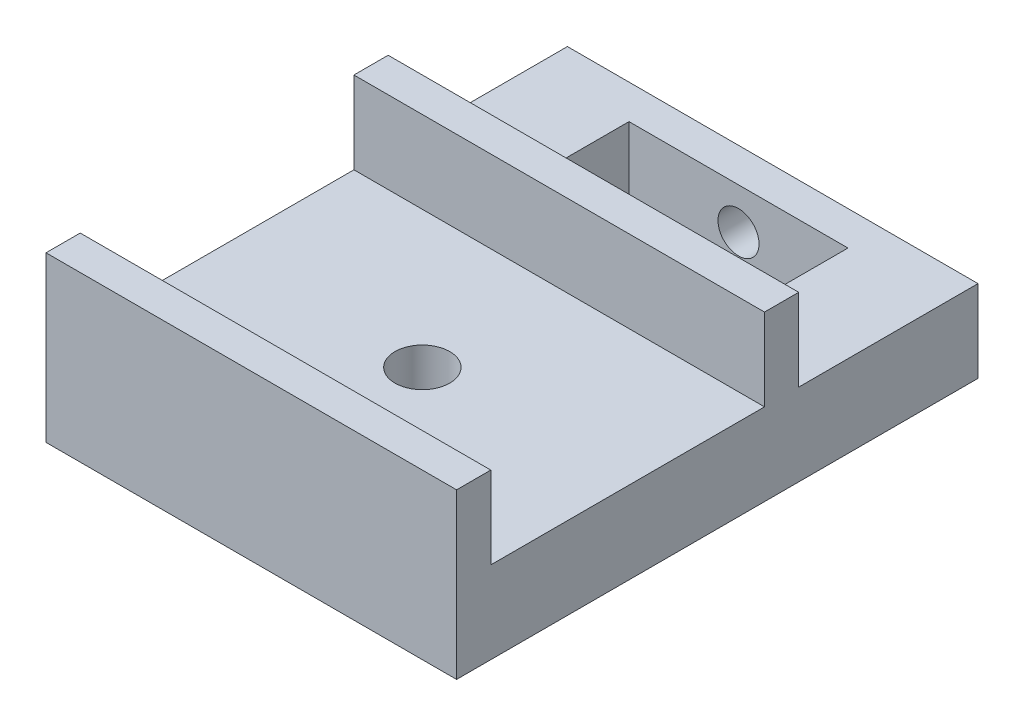
ISO-10303-21;
HEADER;
FILE_DESCRIPTION(('STEP AP214'),'2;1');
FILE_NAME('part.step','',(''),(''),'','','');
FILE_SCHEMA(('AUTOMOTIVE_DESIGN { 1 0 10303 214 1 1 1 1 }'));
ENDSEC;
DATA;
#1=APPLICATION_CONTEXT('core data for automotive mechanical design processes');
#2=APPLICATION_PROTOCOL_DEFINITION('international standard','automotive_design',2000,#1);
#3=PRODUCT_CONTEXT('',#1,'mechanical');
#4=PRODUCT('Part','Part','',(#3));
#5=PRODUCT_RELATED_PRODUCT_CATEGORY('part','',(#4));
#6=PRODUCT_DEFINITION_FORMATION('','',#4);
#7=PRODUCT_DEFINITION_CONTEXT('part definition',#1,'design');
#8=PRODUCT_DEFINITION('design','',#6,#7);
#9=PRODUCT_DEFINITION_SHAPE('','',#8);
#10=(LENGTH_UNIT() NAMED_UNIT(*) SI_UNIT(.MILLI.,.METRE.));
#11=(NAMED_UNIT(*) PLANE_ANGLE_UNIT() SI_UNIT($,.RADIAN.));
#12=(NAMED_UNIT(*) SI_UNIT($,.STERADIAN.) SOLID_ANGLE_UNIT());
#13=UNCERTAINTY_MEASURE_WITH_UNIT(LENGTH_MEASURE(1.E-05),#10,'distance_accuracy_value','');
#14=(GEOMETRIC_REPRESENTATION_CONTEXT(3) GLOBAL_UNCERTAINTY_ASSIGNED_CONTEXT((#13)) GLOBAL_UNIT_ASSIGNED_CONTEXT((#10,
#11,#12)) REPRESENTATION_CONTEXT('',''));
#15=CARTESIAN_POINT('',(0.,0.,0.));
#16=DIRECTION('',(0.,0.,1.));
#17=DIRECTION('',(1.,0.,0.));
#18=AXIS2_PLACEMENT_3D('',#15,#16,#17);
#19=CARTESIAN_POINT('',(0.,6.,0.));
#20=DIRECTION('',(0.,1.,0.));
#21=DIRECTION('',(0.,0.,1.));
#22=AXIS2_PLACEMENT_3D('',#19,#20,#21);
#23=PLANE('',#22);
#24=DIRECTION('',(-1.,0.,0.));
#25=VECTOR('',#24,1.);
#26=CARTESIAN_POINT('',(0.,6.,-2.5));
#27=LINE('',#26,#25);
#28=CARTESIAN_POINT('',(0.,6.,-2.5));
#29=VERTEX_POINT('',#28);
#30=CARTESIAN_POINT('',(-7.,6.,-2.5));
#31=VERTEX_POINT('',#30);
#32=EDGE_CURVE('E171',#29,#31,#27,.T.);
#33=ORIENTED_EDGE('',*,*,#32,.F.);
#34=DIRECTION('',(0.,0.,1.));
#35=VECTOR('',#34,1.);
#36=CARTESIAN_POINT('',(0.,6.,0.));
#37=LINE('',#36,#35);
#38=CARTESIAN_POINT('',(0.,6.,-15.6));
#39=VERTEX_POINT('',#38);
#40=EDGE_CURVE('E200',#39,#29,#37,.T.);
#41=ORIENTED_EDGE('',*,*,#40,.F.);
#42=DIRECTION('',(-1.,0.,0.));
#43=VECTOR('',#42,1.);
#44=CARTESIAN_POINT('',(0.,6.,-15.6));
#45=LINE('',#44,#43);
#46=CARTESIAN_POINT('',(-30.,6.,-15.6));
#47=VERTEX_POINT('',#46);
#48=EDGE_CURVE('E193',#39,#47,#45,.T.);
#49=ORIENTED_EDGE('',*,*,#48,.T.);
#50=DIRECTION('',(0.,0.,1.));
#51=VECTOR('',#50,1.);
#52=CARTESIAN_POINT('',(-30.,6.,0.));
#53=LINE('',#52,#51);
#54=CARTESIAN_POINT('',(-30.,6.,-2.5));
#55=VERTEX_POINT('',#54);
#56=EDGE_CURVE('E198',#47,#55,#53,.T.);
#57=ORIENTED_EDGE('',*,*,#56,.T.);
#58=CARTESIAN_POINT('',(-23.,6.,-2.5));
#59=VERTEX_POINT('',#58);
#60=EDGE_CURVE('E141',#59,#55,#27,.T.);
#61=ORIENTED_EDGE('',*,*,#60,.F.);
#62=DIRECTION('',(0.,0.,-1.));
#63=VECTOR('',#62,1.);
#64=CARTESIAN_POINT('',(-23.,6.,0.));
#65=LINE('',#64,#63);
#66=CARTESIAN_POINT('',(-23.,6.,-13.1));
#67=VERTEX_POINT('',#66);
#68=EDGE_CURVE('E203',#59,#67,#65,.T.);
#69=ORIENTED_EDGE('',*,*,#68,.T.);
#70=DIRECTION('',(1.,0.,0.));
#71=VECTOR('',#70,1.);
#72=CARTESIAN_POINT('',(0.,6.,-13.1));
#73=LINE('',#72,#71);
#74=CARTESIAN_POINT('',(-7.,6.,-13.1));
#75=VERTEX_POINT('',#74);
#76=EDGE_CURVE('E206',#67,#75,#73,.T.);
#77=ORIENTED_EDGE('',*,*,#76,.T.);
#78=DIRECTION('',(0.,0.,-1.));
#79=VECTOR('',#78,1.);
#80=CARTESIAN_POINT('',(-7.,6.,0.));
#81=LINE('',#80,#79);
#82=EDGE_CURVE('E208',#31,#75,#81,.T.);
#83=ORIENTED_EDGE('',*,*,#82,.F.);
#84=EDGE_LOOP('',(#33,#41,#49,#57,#61,#69,#77,#83));
#85=FACE_BOUND('',#84,.T.);
#86=ADVANCED_FACE('F34',(#85),#23,.T.);
#87=CARTESIAN_POINT('',(-15.,6.,10.));
#88=DIRECTION('',(0.,1.,0.));
#89=DIRECTION('',(0.,0.,1.));
#90=AXIS2_PLACEMENT_3D('',#87,#88,#89);
#91=CIRCLE('',#90,2.);
#92=CARTESIAN_POINT('',(-15.,6.,12.));
#93=VERTEX_POINT('',#92);
#94=EDGE_CURVE('E310',#93,#93,#91,.T.);
#95=ORIENTED_EDGE('',*,*,#94,.F.);
#96=EDGE_LOOP('',(#95));
#97=FACE_BOUND('',#96,.T.);
#98=DIRECTION('',(1.,0.,0.));
#99=VECTOR('',#98,1.);
#100=CARTESIAN_POINT('',(0.,6.,0.));
#101=LINE('',#100,#99);
#102=CARTESIAN_POINT('',(-30.,6.,0.));
#103=VERTEX_POINT('',#102);
#104=CARTESIAN_POINT('',(0.,6.,0.));
#105=VERTEX_POINT('',#104);
#106=EDGE_CURVE('E145',#103,#105,#101,.T.);
#107=ORIENTED_EDGE('',*,*,#106,.F.);
#108=CARTESIAN_POINT('',(-30.,6.,20.));
#109=VERTEX_POINT('',#108);
#110=EDGE_CURVE('E196',#103,#109,#53,.T.);
#111=ORIENTED_EDGE('',*,*,#110,.T.);
#112=DIRECTION('',(1.,0.,0.));
#113=VECTOR('',#112,1.);
#114=CARTESIAN_POINT('',(0.,6.,20.));
#115=LINE('',#114,#113);
#116=CARTESIAN_POINT('',(0.,6.,20.));
#117=VERTEX_POINT('',#116);
#118=EDGE_CURVE('E189',#109,#117,#115,.T.);
#119=ORIENTED_EDGE('',*,*,#118,.T.);
#120=EDGE_CURVE('E56',#105,#117,#37,.T.);
#121=ORIENTED_EDGE('',*,*,#120,.F.);
#122=EDGE_LOOP('',(#107,#111,#119,#121));
#123=FACE_BOUND('',#122,.T.);
#124=ADVANCED_FACE('F266',(#97,#123),#23,.T.);
#125=CARTESIAN_POINT('',(0.,6.,-2.5));
#126=DIRECTION('',(0.,0.,-1.));
#127=DIRECTION('',(-1.,0.,0.));
#128=AXIS2_PLACEMENT_3D('',#125,#126,#127);
#129=PLANE('',#128);
#130=CARTESIAN_POINT('',(-15.,3.,-2.5));
#131=DIRECTION('',(0.,0.,-1.));
#132=DIRECTION('',(-1.,0.,0.));
#133=AXIS2_PLACEMENT_3D('',#130,#131,#132);
#134=CIRCLE('',#133,1.5);
#135=CARTESIAN_POINT('',(-16.5,3.,-2.5));
#136=VERTEX_POINT('',#135);
#137=EDGE_CURVE('E156',#136,#136,#134,.T.);
#138=ORIENTED_EDGE('',*,*,#137,.F.);
#139=EDGE_LOOP('',(#138));
#140=FACE_BOUND('',#139,.T.);
#141=DIRECTION('',(1.,0.,0.));
#142=VECTOR('',#141,1.);
#143=CARTESIAN_POINT('',(0.,0.,-2.5));
#144=LINE('',#143,#142);
#145=CARTESIAN_POINT('',(-23.,0.,-2.5));
#146=VERTEX_POINT('',#145);
#147=CARTESIAN_POINT('',(-7.,0.,-2.5));
#148=VERTEX_POINT('',#147);
#149=EDGE_CURVE('E221',#146,#148,#144,.T.);
#150=ORIENTED_EDGE('',*,*,#149,.F.);
#151=DIRECTION('',(0.,-1.,0.));
#152=VECTOR('',#151,1.);
#153=CARTESIAN_POINT('',(-23.,6.,-2.5));
#154=LINE('',#153,#152);
#155=EDGE_CURVE('E11',#59,#146,#154,.T.);
#156=ORIENTED_EDGE('',*,*,#155,.F.);
#157=ORIENTED_EDGE('',*,*,#60,.T.);
#158=DIRECTION('',(0.,-1.,0.));
#159=VECTOR('',#158,1.);
#160=CARTESIAN_POINT('',(-30.,12.,-2.5));
#161=LINE('',#160,#159);
#162=CARTESIAN_POINT('',(-30.,12.,-2.5));
#163=VERTEX_POINT('',#162);
#164=EDGE_CURVE('E135',#163,#55,#161,.T.);
#165=ORIENTED_EDGE('',*,*,#164,.F.);
#166=DIRECTION('',(1.,0.,0.));
#167=VECTOR('',#166,1.);
#168=CARTESIAN_POINT('',(0.,12.,-2.5));
#169=LINE('',#168,#167);
#170=CARTESIAN_POINT('',(0.,12.,-2.5));
#171=VERTEX_POINT('',#170);
#172=EDGE_CURVE('E139',#163,#171,#169,.T.);
#173=ORIENTED_EDGE('',*,*,#172,.T.);
#174=DIRECTION('',(0.,-1.,0.));
#175=VECTOR('',#174,1.);
#176=CARTESIAN_POINT('',(0.,12.,-2.5));
#177=LINE('',#176,#175);
#178=EDGE_CURVE('E166',#171,#29,#177,.T.);
#179=ORIENTED_EDGE('',*,*,#178,.T.);
#180=ORIENTED_EDGE('',*,*,#32,.T.);
#181=DIRECTION('',(0.,-1.,0.));
#182=VECTOR('',#181,1.);
#183=CARTESIAN_POINT('',(-7.,6.,-2.5));
#184=LINE('',#183,#182);
#185=EDGE_CURVE('E232',#31,#148,#184,.T.);
#186=ORIENTED_EDGE('',*,*,#185,.T.);
#187=EDGE_LOOP('',(#150,#156,#157,#165,#173,#179,#180,#186));
#188=FACE_BOUND('',#187,.T.);
#189=ADVANCED_FACE('F138',(#140,#188),#129,.T.);
#190=CARTESIAN_POINT('',(-23.,6.,0.));
#191=DIRECTION('',(-1.,0.,0.));
#192=DIRECTION('',(0.,0.,1.));
#193=AXIS2_PLACEMENT_3D('',#190,#191,#192);
#194=PLANE('',#193);
#195=DIRECTION('',(0.,0.,-1.));
#196=VECTOR('',#195,1.);
#197=CARTESIAN_POINT('',(-23.,0.,0.));
#198=LINE('',#197,#196);
#199=CARTESIAN_POINT('',(-23.,0.,-13.1));
#200=VERTEX_POINT('',#199);
#201=EDGE_CURVE('E224',#146,#200,#198,.T.);
#202=ORIENTED_EDGE('',*,*,#201,.T.);
#203=DIRECTION('',(0.,-1.,0.));
#204=VECTOR('',#203,1.);
#205=CARTESIAN_POINT('',(-23.,6.,-13.1));
#206=LINE('',#205,#204);
#207=EDGE_CURVE('E43',#67,#200,#206,.T.);
#208=ORIENTED_EDGE('',*,*,#207,.F.);
#209=ORIENTED_EDGE('',*,*,#68,.F.);
#210=ORIENTED_EDGE('',*,*,#155,.T.);
#211=EDGE_LOOP('',(#202,#208,#209,#210));
#212=FACE_BOUND('',#211,.T.);
#213=ADVANCED_FACE('F287',(#212),#194,.F.);
#214=CARTESIAN_POINT('',(0.,6.,-13.1));
#215=DIRECTION('',(0.,0.,-1.));
#216=DIRECTION('',(-1.,0.,0.));
#217=AXIS2_PLACEMENT_3D('',#214,#215,#216);
#218=PLANE('',#217);
#219=CARTESIAN_POINT('',(-15.,3.,-13.1));
#220=DIRECTION('',(0.,0.,-1.));
#221=DIRECTION('',(-1.,0.,0.));
#222=AXIS2_PLACEMENT_3D('',#219,#220,#221);
#223=CIRCLE('',#222,1.5);
#224=CARTESIAN_POINT('',(-16.5,3.,-13.1));
#225=VERTEX_POINT('',#224);
#226=EDGE_CURVE('E299',#225,#225,#223,.T.);
#227=ORIENTED_EDGE('',*,*,#226,.T.);
#228=EDGE_LOOP('',(#227));
#229=FACE_BOUND('',#228,.T.);
#230=DIRECTION('',(1.,0.,0.));
#231=VECTOR('',#230,1.);
#232=CARTESIAN_POINT('',(0.,0.,-13.1));
#233=LINE('',#232,#231);
#234=CARTESIAN_POINT('',(-7.,0.,-13.1));
#235=VERTEX_POINT('',#234);
#236=EDGE_CURVE('E227',#200,#235,#233,.T.);
#237=ORIENTED_EDGE('',*,*,#236,.T.);
#238=DIRECTION('',(0.,-1.,0.));
#239=VECTOR('',#238,1.);
#240=CARTESIAN_POINT('',(-7.,6.,-13.1));
#241=LINE('',#240,#239);
#242=EDGE_CURVE('E234',#75,#235,#241,.T.);
#243=ORIENTED_EDGE('',*,*,#242,.F.);
#244=ORIENTED_EDGE('',*,*,#76,.F.);
#245=ORIENTED_EDGE('',*,*,#207,.T.);
#246=EDGE_LOOP('',(#237,#243,#244,#245));
#247=FACE_BOUND('',#246,.T.);
#248=ADVANCED_FACE('F284',(#229,#247),#218,.F.);
#249=CARTESIAN_POINT('',(0.,6.,-15.6));
#250=DIRECTION('',(0.,0.,1.));
#251=DIRECTION('',(1.,0.,0.));
#252=AXIS2_PLACEMENT_3D('',#249,#250,#251);
#253=PLANE('',#252);
#254=CARTESIAN_POINT('',(-15.,3.,-15.6));
#255=DIRECTION('',(0.,0.,-1.));
#256=DIRECTION('',(-1.,0.,0.));
#257=AXIS2_PLACEMENT_3D('',#254,#255,#256);
#258=CIRCLE('',#257,1.5);
#259=CARTESIAN_POINT('',(-16.5,3.,-15.6));
#260=VERTEX_POINT('',#259);
#261=EDGE_CURVE('E304',#260,#260,#258,.T.);
#262=ORIENTED_EDGE('',*,*,#261,.F.);
#263=EDGE_LOOP('',(#262));
#264=FACE_BOUND('',#263,.T.);
#265=DIRECTION('',(-1.,0.,0.));
#266=VECTOR('',#265,1.);
#267=CARTESIAN_POINT('',(0.,0.,-15.6));
#268=LINE('',#267,#266);
#269=CARTESIAN_POINT('',(0.,0.,-15.6));
#270=VERTEX_POINT('',#269);
#271=CARTESIAN_POINT('',(-30.,0.,-15.6));
#272=VERTEX_POINT('',#271);
#273=EDGE_CURVE('E192',#270,#272,#268,.T.);
#274=ORIENTED_EDGE('',*,*,#273,.T.);
#275=DIRECTION('',(0.,-1.,0.));
#276=VECTOR('',#275,1.);
#277=CARTESIAN_POINT('',(-30.,6.,-15.6));
#278=LINE('',#277,#276);
#279=EDGE_CURVE('E38',#47,#272,#278,.T.);
#280=ORIENTED_EDGE('',*,*,#279,.F.);
#281=ORIENTED_EDGE('',*,*,#48,.F.);
#282=DIRECTION('',(0.,-1.,0.));
#283=VECTOR('',#282,1.);
#284=CARTESIAN_POINT('',(0.,6.,-15.6));
#285=LINE('',#284,#283);
#286=EDGE_CURVE('E211',#39,#270,#285,.T.);
#287=ORIENTED_EDGE('',*,*,#286,.T.);
#288=EDGE_LOOP('',(#274,#280,#281,#287));
#289=FACE_BOUND('',#288,.T.);
#290=ADVANCED_FACE('F36',(#264,#289),#253,.F.);
#291=CARTESIAN_POINT('',(-30.,6.,0.));
#292=DIRECTION('',(1.,0.,0.));
#293=DIRECTION('',(0.,0.,-1.));
#294=AXIS2_PLACEMENT_3D('',#291,#292,#293);
#295=PLANE('',#294);
#296=ORIENTED_EDGE('',*,*,#110,.F.);
#297=DIRECTION('',(0.,-1.,0.));
#298=VECTOR('',#297,1.);
#299=CARTESIAN_POINT('',(-30.,12.,0.));
#300=LINE('',#299,#298);
#301=CARTESIAN_POINT('',(-30.,12.,0.));
#302=VERTEX_POINT('',#301);
#303=EDGE_CURVE('E146',#302,#103,#300,.T.);
#304=ORIENTED_EDGE('',*,*,#303,.F.);
#305=DIRECTION('',(0.,0.,-1.));
#306=VECTOR('',#305,1.);
#307=CARTESIAN_POINT('',(-30.,12.,0.));
#308=LINE('',#307,#306);
#309=EDGE_CURVE('E152',#302,#163,#308,.T.);
#310=ORIENTED_EDGE('',*,*,#309,.T.);
#311=ORIENTED_EDGE('',*,*,#164,.T.);
#312=ORIENTED_EDGE('',*,*,#56,.F.);
#313=ORIENTED_EDGE('',*,*,#279,.T.);
#314=DIRECTION('',(0.,0.,1.));
#315=VECTOR('',#314,1.);
#316=CARTESIAN_POINT('',(-30.,0.,0.));
#317=LINE('',#316,#315);
#318=CARTESIAN_POINT('',(-30.,0.,22.5));
#319=VERTEX_POINT('',#318);
#320=EDGE_CURVE('E214',#272,#319,#317,.T.);
#321=ORIENTED_EDGE('',*,*,#320,.T.);
#322=DIRECTION('',(0.,-1.,0.));
#323=VECTOR('',#322,1.);
#324=CARTESIAN_POINT('',(-30.,6.,22.5));
#325=LINE('',#324,#323);
#326=CARTESIAN_POINT('',(-30.,12.,22.5));
#327=VERTEX_POINT('',#326);
#328=EDGE_CURVE('E241',#327,#319,#325,.T.);
#329=ORIENTED_EDGE('',*,*,#328,.F.);
#330=DIRECTION('',(0.,0.,-1.));
#331=VECTOR('',#330,1.);
#332=CARTESIAN_POINT('',(-30.,12.,0.));
#333=LINE('',#332,#331);
#334=CARTESIAN_POINT('',(-30.,12.,20.));
#335=VERTEX_POINT('',#334);
#336=EDGE_CURVE('E173',#327,#335,#333,.T.);
#337=ORIENTED_EDGE('',*,*,#336,.T.);
#338=DIRECTION('',(0.,-1.,0.));
#339=VECTOR('',#338,1.);
#340=CARTESIAN_POINT('',(-30.,12.,20.));
#341=LINE('',#340,#339);
#342=EDGE_CURVE('E184',#335,#109,#341,.T.);
#343=ORIENTED_EDGE('',*,*,#342,.T.);
#344=EDGE_LOOP('',(#296,#304,#310,#311,#312,#313,#321,#329,#337,#343));
#345=FACE_BOUND('',#344,.T.);
#346=ADVANCED_FACE('F159',(#345),#295,.F.);
#347=CARTESIAN_POINT('',(0.,6.,22.5));
#348=DIRECTION('',(0.,0.,1.));
#349=DIRECTION('',(1.,0.,0.));
#350=AXIS2_PLACEMENT_3D('',#347,#348,#349);
#351=PLANE('',#350);
#352=DIRECTION('',(-1.,0.,0.));
#353=VECTOR('',#352,1.);
#354=CARTESIAN_POINT('',(0.,0.,22.5));
#355=LINE('',#354,#353);
#356=CARTESIAN_POINT('',(0.,0.,22.5));
#357=VERTEX_POINT('',#356);
#358=EDGE_CURVE('E216',#357,#319,#355,.T.);
#359=ORIENTED_EDGE('',*,*,#358,.F.);
#360=DIRECTION('',(0.,-1.,0.));
#361=VECTOR('',#360,1.);
#362=CARTESIAN_POINT('',(0.,6.,22.5));
#363=LINE('',#362,#361);
#364=CARTESIAN_POINT('',(0.,12.,22.5));
#365=VERTEX_POINT('',#364);
#366=EDGE_CURVE('E239',#365,#357,#363,.T.);
#367=ORIENTED_EDGE('',*,*,#366,.F.);
#368=DIRECTION('',(-1.,0.,0.));
#369=VECTOR('',#368,1.);
#370=CARTESIAN_POINT('',(0.,12.,22.5));
#371=LINE('',#370,#369);
#372=EDGE_CURVE('E176',#365,#327,#371,.T.);
#373=ORIENTED_EDGE('',*,*,#372,.T.);
#374=ORIENTED_EDGE('',*,*,#328,.T.);
#375=EDGE_LOOP('',(#359,#367,#373,#374));
#376=FACE_BOUND('',#375,.T.);
#377=ADVANCED_FACE('F256',(#376),#351,.T.);
#378=CARTESIAN_POINT('',(0.,6.,0.));
#379=DIRECTION('',(1.,0.,0.));
#380=DIRECTION('',(0.,0.,-1.));
#381=AXIS2_PLACEMENT_3D('',#378,#379,#380);
#382=PLANE('',#381);
#383=ORIENTED_EDGE('',*,*,#366,.T.);
#384=DIRECTION('',(0.,0.,1.));
#385=VECTOR('',#384,1.);
#386=CARTESIAN_POINT('',(0.,0.,0.));
#387=LINE('',#386,#385);
#388=EDGE_CURVE('E219',#270,#357,#387,.T.);
#389=ORIENTED_EDGE('',*,*,#388,.F.);
#390=ORIENTED_EDGE('',*,*,#286,.F.);
#391=ORIENTED_EDGE('',*,*,#40,.T.);
#392=ORIENTED_EDGE('',*,*,#178,.F.);
#393=DIRECTION('',(0.,0.,-1.));
#394=VECTOR('',#393,1.);
#395=CARTESIAN_POINT('',(0.,12.,0.));
#396=LINE('',#395,#394);
#397=CARTESIAN_POINT('',(0.,12.,0.));
#398=VERTEX_POINT('',#397);
#399=EDGE_CURVE('E154',#398,#171,#396,.T.);
#400=ORIENTED_EDGE('',*,*,#399,.F.);
#401=DIRECTION('',(0.,-1.,0.));
#402=VECTOR('',#401,1.);
#403=CARTESIAN_POINT('',(0.,12.,0.));
#404=LINE('',#403,#402);
#405=EDGE_CURVE('E51',#398,#105,#404,.T.);
#406=ORIENTED_EDGE('',*,*,#405,.T.);
#407=ORIENTED_EDGE('',*,*,#120,.T.);
#408=DIRECTION('',(0.,-1.,0.));
#409=VECTOR('',#408,1.);
#410=CARTESIAN_POINT('',(0.,12.,20.));
#411=LINE('',#410,#409);
#412=CARTESIAN_POINT('',(0.,12.,20.));
#413=VERTEX_POINT('',#412);
#414=EDGE_CURVE('E187',#413,#117,#411,.T.);
#415=ORIENTED_EDGE('',*,*,#414,.F.);
#416=DIRECTION('',(0.,0.,1.));
#417=VECTOR('',#416,1.);
#418=CARTESIAN_POINT('',(0.,12.,0.));
#419=LINE('',#418,#417);
#420=EDGE_CURVE('E179',#413,#365,#419,.T.);
#421=ORIENTED_EDGE('',*,*,#420,.T.);
#422=EDGE_LOOP('',(#383,#389,#390,#391,#392,#400,#406,#407,#415,#421));
#423=FACE_BOUND('',#422,.T.);
#424=ADVANCED_FACE('F253',(#423),#382,.T.);
#425=CARTESIAN_POINT('',(-7.,6.,0.));
#426=DIRECTION('',(-1.,0.,0.));
#427=DIRECTION('',(0.,0.,1.));
#428=AXIS2_PLACEMENT_3D('',#425,#426,#427);
#429=PLANE('',#428);
#430=DIRECTION('',(0.,0.,-1.));
#431=VECTOR('',#430,1.);
#432=CARTESIAN_POINT('',(-7.,0.,0.));
#433=LINE('',#432,#431);
#434=EDGE_CURVE('E197',#148,#235,#433,.T.);
#435=ORIENTED_EDGE('',*,*,#434,.F.);
#436=ORIENTED_EDGE('',*,*,#185,.F.);
#437=ORIENTED_EDGE('',*,*,#82,.T.);
#438=ORIENTED_EDGE('',*,*,#242,.T.);
#439=EDGE_LOOP('',(#435,#436,#437,#438));
#440=FACE_BOUND('',#439,.T.);
#441=ADVANCED_FACE('F263',(#440),#429,.T.);
#442=CARTESIAN_POINT('',(0.,0.,0.));
#443=DIRECTION('',(0.,1.,0.));
#444=DIRECTION('',(0.,0.,1.));
#445=AXIS2_PLACEMENT_3D('',#442,#443,#444);
#446=PLANE('',#445);
#447=CARTESIAN_POINT('',(-15.,0.,10.));
#448=DIRECTION('',(0.,1.,0.));
#449=DIRECTION('',(0.,0.,1.));
#450=AXIS2_PLACEMENT_3D('',#447,#448,#449);
#451=CIRCLE('',#450,2.);
#452=CARTESIAN_POINT('',(-15.,0.,12.));
#453=VERTEX_POINT('',#452);
#454=EDGE_CURVE('E307',#453,#453,#451,.T.);
#455=ORIENTED_EDGE('',*,*,#454,.T.);
#456=EDGE_LOOP('',(#455));
#457=FACE_BOUND('',#456,.T.);
#458=ORIENTED_EDGE('',*,*,#149,.T.);
#459=ORIENTED_EDGE('',*,*,#434,.T.);
#460=ORIENTED_EDGE('',*,*,#236,.F.);
#461=ORIENTED_EDGE('',*,*,#201,.F.);
#462=EDGE_LOOP('',(#458,#459,#460,#461));
#463=FACE_BOUND('',#462,.T.);
#464=ORIENTED_EDGE('',*,*,#358,.T.);
#465=ORIENTED_EDGE('',*,*,#320,.F.);
#466=ORIENTED_EDGE('',*,*,#273,.F.);
#467=ORIENTED_EDGE('',*,*,#388,.T.);
#468=EDGE_LOOP('',(#464,#465,#466,#467));
#469=FACE_BOUND('',#468,.T.);
#470=ADVANCED_FACE('F252',(#457,#463,#469),#446,.F.);
#471=CARTESIAN_POINT('',(0.,12.,20.));
#472=DIRECTION('',(0.,0.,1.));
#473=DIRECTION('',(1.,0.,0.));
#474=AXIS2_PLACEMENT_3D('',#471,#472,#473);
#475=PLANE('',#474);
#476=ORIENTED_EDGE('',*,*,#118,.F.);
#477=ORIENTED_EDGE('',*,*,#342,.F.);
#478=DIRECTION('',(-1.,0.,0.));
#479=VECTOR('',#478,1.);
#480=CARTESIAN_POINT('',(0.,12.,20.));
#481=LINE('',#480,#479);
#482=EDGE_CURVE('E182',#413,#335,#481,.T.);
#483=ORIENTED_EDGE('',*,*,#482,.F.);
#484=ORIENTED_EDGE('',*,*,#414,.T.);
#485=EDGE_LOOP('',(#476,#477,#483,#484));
#486=FACE_BOUND('',#485,.T.);
#487=ADVANCED_FACE('F276',(#486),#475,.F.);
#488=CARTESIAN_POINT('',(0.,12.,0.));
#489=DIRECTION('',(0.,1.,0.));
#490=DIRECTION('',(0.,0.,1.));
#491=AXIS2_PLACEMENT_3D('',#488,#489,#490);
#492=PLANE('',#491);
#493=ORIENTED_EDGE('',*,*,#336,.F.);
#494=ORIENTED_EDGE('',*,*,#372,.F.);
#495=ORIENTED_EDGE('',*,*,#420,.F.);
#496=ORIENTED_EDGE('',*,*,#482,.T.);
#497=EDGE_LOOP('',(#493,#494,#495,#496));
#498=FACE_BOUND('',#497,.T.);
#499=ADVANCED_FACE('F332',(#498),#492,.T.);
#500=CARTESIAN_POINT('',(0.,12.,0.));
#501=DIRECTION('',(0.,0.,1.));
#502=DIRECTION('',(1.,0.,0.));
#503=AXIS2_PLACEMENT_3D('',#500,#501,#502);
#504=PLANE('',#503);
#505=ORIENTED_EDGE('',*,*,#303,.T.);
#506=ORIENTED_EDGE('',*,*,#106,.T.);
#507=ORIENTED_EDGE('',*,*,#405,.F.);
#508=DIRECTION('',(-1.,0.,0.));
#509=VECTOR('',#508,1.);
#510=CARTESIAN_POINT('',(0.,12.,0.));
#511=LINE('',#510,#509);
#512=EDGE_CURVE('E160',#398,#302,#511,.T.);
#513=ORIENTED_EDGE('',*,*,#512,.T.);
#514=EDGE_LOOP('',(#505,#506,#507,#513));
#515=FACE_BOUND('',#514,.T.);
#516=ADVANCED_FACE('F334',(#515),#504,.T.);
#517=CARTESIAN_POINT('',(0.,12.,0.));
#518=DIRECTION('',(0.,1.,0.));
#519=DIRECTION('',(0.,0.,1.));
#520=AXIS2_PLACEMENT_3D('',#517,#518,#519);
#521=PLANE('',#520);
#522=ORIENTED_EDGE('',*,*,#172,.F.);
#523=ORIENTED_EDGE('',*,*,#309,.F.);
#524=ORIENTED_EDGE('',*,*,#512,.F.);
#525=ORIENTED_EDGE('',*,*,#399,.T.);
#526=EDGE_LOOP('',(#522,#523,#524,#525));
#527=FACE_BOUND('',#526,.T.);
#528=ADVANCED_FACE('F150',(#527),#521,.T.);
#529=CARTESIAN_POINT('',(-15.,3.,-0.600000000000003));
#530=DIRECTION('',(0.,0.,-1.));
#531=DIRECTION('',(-1.,0.,0.));
#532=AXIS2_PLACEMENT_3D('',#529,#530,#531);
#533=CYLINDRICAL_SURFACE('',#532,1.5);
#534=ORIENTED_EDGE('',*,*,#261,.T.);
#535=EDGE_LOOP('',(#534));
#536=FACE_BOUND('',#535,.T.);
#537=ORIENTED_EDGE('',*,*,#226,.F.);
#538=EDGE_LOOP('',(#537));
#539=FACE_BOUND('',#538,.T.);
#540=ADVANCED_FACE('F343',(#536,#539),#533,.F.);
#541=ORIENTED_EDGE('',*,*,#137,.T.);
#542=EDGE_LOOP('',(#541));
#543=FACE_BOUND('',#542,.T.);
#544=CARTESIAN_POINT('',(-15.,3.,-0.600000000000003));
#545=DIRECTION('',(0.,0.,-1.));
#546=DIRECTION('',(-1.,0.,0.));
#547=AXIS2_PLACEMENT_3D('',#544,#545,#546);
#548=CIRCLE('',#547,1.5);
#549=CARTESIAN_POINT('',(-16.5,3.,-0.600000000000003));
#550=VERTEX_POINT('',#549);
#551=EDGE_CURVE('E301',#550,#550,#548,.T.);
#552=ORIENTED_EDGE('',*,*,#551,.F.);
#553=EDGE_LOOP('',(#552));
#554=FACE_BOUND('',#553,.T.);
#555=ADVANCED_FACE('F344',(#543,#554),#533,.F.);
#556=CARTESIAN_POINT('',(-15.,3.,-0.600000000000003));
#557=DIRECTION('',(0.,0.,-1.));
#558=DIRECTION('',(-1.,0.,0.));
#559=AXIS2_PLACEMENT_3D('',#556,#557,#558);
#560=PLANE('',#559);
#561=ORIENTED_EDGE('',*,*,#551,.T.);
#562=EDGE_LOOP('',(#561));
#563=FACE_BOUND('',#562,.T.);
#564=ADVANCED_FACE('F320',(#563),#560,.T.);
#565=CARTESIAN_POINT('',(-15.,0.,10.));
#566=DIRECTION('',(0.,1.,0.));
#567=DIRECTION('',(0.,0.,1.));
#568=AXIS2_PLACEMENT_3D('',#565,#566,#567);
#569=CYLINDRICAL_SURFACE('',#568,2.);
#570=ORIENTED_EDGE('',*,*,#454,.F.);
#571=EDGE_LOOP('',(#570));
#572=FACE_BOUND('',#571,.T.);
#573=ORIENTED_EDGE('',*,*,#94,.T.);
#574=EDGE_LOOP('',(#573));
#575=FACE_BOUND('',#574,.T.);
#576=ADVANCED_FACE('F317',(#572,#575),#569,.F.);
#577=CLOSED_SHELL('',(#86,#124,#189,#213,#248,#290,#346,#377,#424,#441,#470,#487,#499,#516,#528,
#540,#555,#564,#576));
#578=MANIFOLD_SOLID_BREP('B2',#577);
#579=ADVANCED_BREP_SHAPE_REPRESENTATION('',(#18,#578),#14);
#580=SHAPE_DEFINITION_REPRESENTATION(#9,#579);
ENDSEC;
END-ISO-10303-21;
